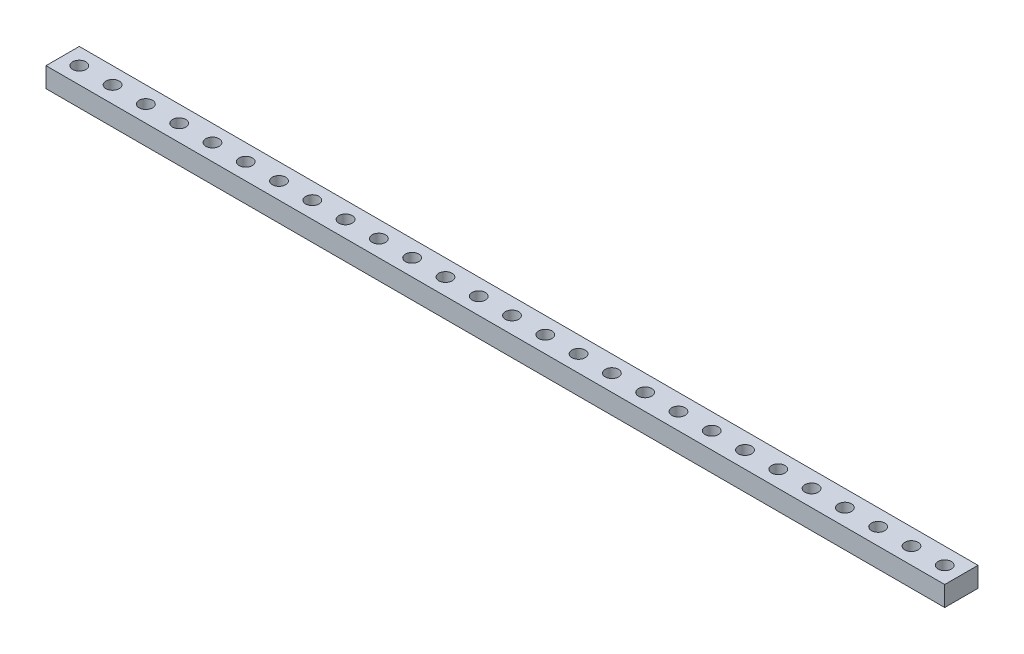
ISO-10303-21;
HEADER;
FILE_DESCRIPTION(('STEP AP214'),'2;1');
FILE_NAME('part.step','',(''),(''),'','','');
FILE_SCHEMA(('AUTOMOTIVE_DESIGN { 1 0 10303 214 1 1 1 1 }'));
ENDSEC;
DATA;
#1=APPLICATION_CONTEXT('core data for automotive mechanical design processes');
#2=APPLICATION_PROTOCOL_DEFINITION('international standard','automotive_design',2000,#1);
#3=PRODUCT_CONTEXT('',#1,'mechanical');
#4=PRODUCT('Part','Part','',(#3));
#5=PRODUCT_RELATED_PRODUCT_CATEGORY('part','',(#4));
#6=PRODUCT_DEFINITION_FORMATION('','',#4);
#7=PRODUCT_DEFINITION_CONTEXT('part definition',#1,'design');
#8=PRODUCT_DEFINITION('design','',#6,#7);
#9=PRODUCT_DEFINITION_SHAPE('','',#8);
#10=(LENGTH_UNIT() NAMED_UNIT(*) SI_UNIT(.MILLI.,.METRE.));
#11=(NAMED_UNIT(*) PLANE_ANGLE_UNIT() SI_UNIT($,.RADIAN.));
#12=(NAMED_UNIT(*) SI_UNIT($,.STERADIAN.) SOLID_ANGLE_UNIT());
#13=UNCERTAINTY_MEASURE_WITH_UNIT(LENGTH_MEASURE(1.E-05),#10,'distance_accuracy_value','');
#14=(GEOMETRIC_REPRESENTATION_CONTEXT(3) GLOBAL_UNCERTAINTY_ASSIGNED_CONTEXT((#13)) GLOBAL_UNIT_ASSIGNED_CONTEXT((#10,
#11,#12)) REPRESENTATION_CONTEXT('',''));
#15=CARTESIAN_POINT('',(0.,0.,0.));
#16=DIRECTION('',(0.,0.,1.));
#17=DIRECTION('',(1.,0.,0.));
#18=AXIS2_PLACEMENT_3D('',#15,#16,#17);
#19=CARTESIAN_POINT('',(0.,6.,0.));
#20=DIRECTION('',(0.,-1.,0.));
#21=DIRECTION('',(0.,0.,-1.));
#22=AXIS2_PLACEMENT_3D('',#19,#20,#21);
#23=PLANE('',#22);
#24=DIRECTION('',(1.,0.,0.));
#25=VECTOR('',#24,1.);
#26=CARTESIAN_POINT('',(0.,6.,0.));
#27=LINE('',#26,#25);
#28=CARTESIAN_POINT('',(-140.,6.,0.));
#29=VERTEX_POINT('',#28);
#30=CARTESIAN_POINT('',(130.,6.,0.));
#31=VERTEX_POINT('',#30);
#32=EDGE_CURVE('E90',#29,#31,#27,.T.);
#33=ORIENTED_EDGE('',*,*,#32,.T.);
#34=DIRECTION('',(0.,0.,1.));
#35=VECTOR('',#34,1.);
#36=CARTESIAN_POINT('',(130.,6.,-10.));
#37=LINE('',#36,#35);
#38=CARTESIAN_POINT('',(130.,6.,-10.));
#39=VERTEX_POINT('',#38);
#40=EDGE_CURVE('E263',#39,#31,#37,.T.);
#41=ORIENTED_EDGE('',*,*,#40,.F.);
#42=DIRECTION('',(-1.,0.,0.));
#43=VECTOR('',#42,1.);
#44=CARTESIAN_POINT('',(-140.,6.,-9.99999999999998));
#45=LINE('',#44,#43);
#46=CARTESIAN_POINT('',(-140.,6.,-9.99999999999998));
#47=VERTEX_POINT('',#46);
#48=EDGE_CURVE('E92',#39,#47,#45,.T.);
#49=ORIENTED_EDGE('',*,*,#48,.T.);
#50=DIRECTION('',(0.,0.,1.));
#51=VECTOR('',#50,1.);
#52=CARTESIAN_POINT('',(-140.,6.,0.));
#53=LINE('',#52,#51);
#54=EDGE_CURVE('E61',#47,#29,#53,.T.);
#55=ORIENTED_EDGE('',*,*,#54,.T.);
#56=EDGE_LOOP('',(#33,#41,#49,#55));
#57=FACE_BOUND('',#56,.T.);
#58=CARTESIAN_POINT('',(-135.,6.,-4.99999999999998));
#59=DIRECTION('',(0.,1.,0.));
#60=DIRECTION('',(0.,0.,1.));
#61=AXIS2_PLACEMENT_3D('',#58,#59,#60);
#62=CIRCLE('',#61,2.);
#63=CARTESIAN_POINT('',(-135.,6.,-2.99999999999999));
#64=VERTEX_POINT('',#63);
#65=EDGE_CURVE('E84',#64,#64,#62,.T.);
#66=ORIENTED_EDGE('',*,*,#65,.F.);
#67=EDGE_LOOP('',(#66));
#68=FACE_BOUND('',#67,.T.);
#69=CARTESIAN_POINT('',(-125.,6.,-4.99999999999998));
#70=DIRECTION('',(0.,1.,0.));
#71=DIRECTION('',(0.,0.,1.));
#72=AXIS2_PLACEMENT_3D('',#69,#70,#71);
#73=CIRCLE('',#72,1.99999999999998);
#74=CARTESIAN_POINT('',(-125.,6.,-3.));
#75=VERTEX_POINT('',#74);
#76=EDGE_CURVE('E101',#75,#75,#73,.T.);
#77=ORIENTED_EDGE('',*,*,#76,.F.);
#78=EDGE_LOOP('',(#77));
#79=FACE_BOUND('',#78,.T.);
#80=CARTESIAN_POINT('',(-115.,6.,-4.99999999999998));
#81=DIRECTION('',(0.,1.,0.));
#82=DIRECTION('',(0.,0.,1.));
#83=AXIS2_PLACEMENT_3D('',#80,#81,#82);
#84=CIRCLE('',#83,2.);
#85=CARTESIAN_POINT('',(-115.,6.,-2.99999999999999));
#86=VERTEX_POINT('',#85);
#87=EDGE_CURVE('E107',#86,#86,#84,.T.);
#88=ORIENTED_EDGE('',*,*,#87,.F.);
#89=EDGE_LOOP('',(#88));
#90=FACE_BOUND('',#89,.T.);
#91=CARTESIAN_POINT('',(-105.,6.,-4.99999999999998));
#92=DIRECTION('',(0.,1.,0.));
#93=DIRECTION('',(0.,0.,1.));
#94=AXIS2_PLACEMENT_3D('',#91,#92,#93);
#95=CIRCLE('',#94,2.);
#96=CARTESIAN_POINT('',(-105.,6.,-2.99999999999999));
#97=VERTEX_POINT('',#96);
#98=EDGE_CURVE('E113',#97,#97,#95,.T.);
#99=ORIENTED_EDGE('',*,*,#98,.F.);
#100=EDGE_LOOP('',(#99));
#101=FACE_BOUND('',#100,.T.);
#102=CARTESIAN_POINT('',(-95.,6.,-4.99999999999998));
#103=DIRECTION('',(0.,1.,0.));
#104=DIRECTION('',(0.,0.,1.));
#105=AXIS2_PLACEMENT_3D('',#102,#103,#104);
#106=CIRCLE('',#105,2.);
#107=CARTESIAN_POINT('',(-95.,6.,-2.99999999999999));
#108=VERTEX_POINT('',#107);
#109=EDGE_CURVE('E119',#108,#108,#106,.T.);
#110=ORIENTED_EDGE('',*,*,#109,.F.);
#111=EDGE_LOOP('',(#110));
#112=FACE_BOUND('',#111,.T.);
#113=CARTESIAN_POINT('',(-85.,6.,-4.99999999999998));
#114=DIRECTION('',(0.,1.,0.));
#115=DIRECTION('',(0.,0.,1.));
#116=AXIS2_PLACEMENT_3D('',#113,#114,#115);
#117=CIRCLE('',#116,2.);
#118=CARTESIAN_POINT('',(-85.,6.,-2.99999999999999));
#119=VERTEX_POINT('',#118);
#120=EDGE_CURVE('E125',#119,#119,#117,.T.);
#121=ORIENTED_EDGE('',*,*,#120,.F.);
#122=EDGE_LOOP('',(#121));
#123=FACE_BOUND('',#122,.T.);
#124=CARTESIAN_POINT('',(-75.,6.,-4.99999999999998));
#125=DIRECTION('',(0.,1.,0.));
#126=DIRECTION('',(0.,0.,1.));
#127=AXIS2_PLACEMENT_3D('',#124,#125,#126);
#128=CIRCLE('',#127,2.);
#129=CARTESIAN_POINT('',(-75.,6.,-2.99999999999999));
#130=VERTEX_POINT('',#129);
#131=EDGE_CURVE('E131',#130,#130,#128,.T.);
#132=ORIENTED_EDGE('',*,*,#131,.F.);
#133=EDGE_LOOP('',(#132));
#134=FACE_BOUND('',#133,.T.);
#135=CARTESIAN_POINT('',(-65.,6.,-4.99999999999998));
#136=DIRECTION('',(0.,1.,0.));
#137=DIRECTION('',(0.,0.,1.));
#138=AXIS2_PLACEMENT_3D('',#135,#136,#137);
#139=CIRCLE('',#138,2.);
#140=CARTESIAN_POINT('',(-65.,6.,-2.99999999999999));
#141=VERTEX_POINT('',#140);
#142=EDGE_CURVE('E137',#141,#141,#139,.T.);
#143=ORIENTED_EDGE('',*,*,#142,.F.);
#144=EDGE_LOOP('',(#143));
#145=FACE_BOUND('',#144,.T.);
#146=CARTESIAN_POINT('',(-55.,6.,-4.99999999999998));
#147=DIRECTION('',(0.,1.,0.));
#148=DIRECTION('',(0.,0.,1.));
#149=AXIS2_PLACEMENT_3D('',#146,#147,#148);
#150=CIRCLE('',#149,2.);
#151=CARTESIAN_POINT('',(-55.,6.,-2.99999999999999));
#152=VERTEX_POINT('',#151);
#153=EDGE_CURVE('E143',#152,#152,#150,.T.);
#154=ORIENTED_EDGE('',*,*,#153,.F.);
#155=EDGE_LOOP('',(#154));
#156=FACE_BOUND('',#155,.T.);
#157=CARTESIAN_POINT('',(-45.,6.,-4.99999999999998));
#158=DIRECTION('',(0.,1.,0.));
#159=DIRECTION('',(0.,0.,1.));
#160=AXIS2_PLACEMENT_3D('',#157,#158,#159);
#161=CIRCLE('',#160,2.);
#162=CARTESIAN_POINT('',(-45.,6.,-2.99999999999999));
#163=VERTEX_POINT('',#162);
#164=EDGE_CURVE('E149',#163,#163,#161,.T.);
#165=ORIENTED_EDGE('',*,*,#164,.F.);
#166=EDGE_LOOP('',(#165));
#167=FACE_BOUND('',#166,.T.);
#168=CARTESIAN_POINT('',(-35.,6.,-4.99999999999998));
#169=DIRECTION('',(0.,1.,0.));
#170=DIRECTION('',(0.,0.,1.));
#171=AXIS2_PLACEMENT_3D('',#168,#169,#170);
#172=CIRCLE('',#171,2.);
#173=CARTESIAN_POINT('',(-35.,6.,-2.99999999999999));
#174=VERTEX_POINT('',#173);
#175=EDGE_CURVE('E155',#174,#174,#172,.T.);
#176=ORIENTED_EDGE('',*,*,#175,.F.);
#177=EDGE_LOOP('',(#176));
#178=FACE_BOUND('',#177,.T.);
#179=CARTESIAN_POINT('',(-25.,6.,-4.99999999999998));
#180=DIRECTION('',(0.,1.,0.));
#181=DIRECTION('',(0.,0.,1.));
#182=AXIS2_PLACEMENT_3D('',#179,#180,#181);
#183=CIRCLE('',#182,2.);
#184=CARTESIAN_POINT('',(-25.,6.,-2.99999999999999));
#185=VERTEX_POINT('',#184);
#186=EDGE_CURVE('E161',#185,#185,#183,.T.);
#187=ORIENTED_EDGE('',*,*,#186,.F.);
#188=EDGE_LOOP('',(#187));
#189=FACE_BOUND('',#188,.T.);
#190=CARTESIAN_POINT('',(-15.,6.,-4.99999999999998));
#191=DIRECTION('',(0.,1.,0.));
#192=DIRECTION('',(0.,0.,1.));
#193=AXIS2_PLACEMENT_3D('',#190,#191,#192);
#194=CIRCLE('',#193,2.);
#195=CARTESIAN_POINT('',(-15.,6.,-2.99999999999999));
#196=VERTEX_POINT('',#195);
#197=EDGE_CURVE('E167',#196,#196,#194,.T.);
#198=ORIENTED_EDGE('',*,*,#197,.F.);
#199=EDGE_LOOP('',(#198));
#200=FACE_BOUND('',#199,.T.);
#201=CARTESIAN_POINT('',(-5.,6.,-4.99999999999998));
#202=DIRECTION('',(0.,1.,0.));
#203=DIRECTION('',(0.,0.,1.));
#204=AXIS2_PLACEMENT_3D('',#201,#202,#203);
#205=CIRCLE('',#204,2.);
#206=CARTESIAN_POINT('',(-5.,6.,-2.99999999999999));
#207=VERTEX_POINT('',#206);
#208=EDGE_CURVE('E173',#207,#207,#205,.T.);
#209=ORIENTED_EDGE('',*,*,#208,.F.);
#210=EDGE_LOOP('',(#209));
#211=FACE_BOUND('',#210,.T.);
#212=CARTESIAN_POINT('',(5.,6.,-4.99999999999998));
#213=DIRECTION('',(0.,1.,0.));
#214=DIRECTION('',(0.,0.,1.));
#215=AXIS2_PLACEMENT_3D('',#212,#213,#214);
#216=CIRCLE('',#215,2.);
#217=CARTESIAN_POINT('',(5.,6.,-2.99999999999999));
#218=VERTEX_POINT('',#217);
#219=EDGE_CURVE('E179',#218,#218,#216,.T.);
#220=ORIENTED_EDGE('',*,*,#219,.F.);
#221=EDGE_LOOP('',(#220));
#222=FACE_BOUND('',#221,.T.);
#223=CARTESIAN_POINT('',(15.,6.,-4.99999999999998));
#224=DIRECTION('',(0.,1.,0.));
#225=DIRECTION('',(0.,0.,1.));
#226=AXIS2_PLACEMENT_3D('',#223,#224,#225);
#227=CIRCLE('',#226,2.);
#228=CARTESIAN_POINT('',(15.,6.,-2.99999999999999));
#229=VERTEX_POINT('',#228);
#230=EDGE_CURVE('E185',#229,#229,#227,.T.);
#231=ORIENTED_EDGE('',*,*,#230,.F.);
#232=EDGE_LOOP('',(#231));
#233=FACE_BOUND('',#232,.T.);
#234=CARTESIAN_POINT('',(25.,6.,-4.99999999999998));
#235=DIRECTION('',(0.,1.,0.));
#236=DIRECTION('',(0.,0.,1.));
#237=AXIS2_PLACEMENT_3D('',#234,#235,#236);
#238=CIRCLE('',#237,2.);
#239=CARTESIAN_POINT('',(25.,6.,-2.99999999999999));
#240=VERTEX_POINT('',#239);
#241=EDGE_CURVE('E191',#240,#240,#238,.T.);
#242=ORIENTED_EDGE('',*,*,#241,.F.);
#243=EDGE_LOOP('',(#242));
#244=FACE_BOUND('',#243,.T.);
#245=CARTESIAN_POINT('',(35.,6.,-4.99999999999998));
#246=DIRECTION('',(0.,1.,0.));
#247=DIRECTION('',(0.,0.,1.));
#248=AXIS2_PLACEMENT_3D('',#245,#246,#247);
#249=CIRCLE('',#248,2.);
#250=CARTESIAN_POINT('',(35.,6.,-2.99999999999999));
#251=VERTEX_POINT('',#250);
#252=EDGE_CURVE('E197',#251,#251,#249,.T.);
#253=ORIENTED_EDGE('',*,*,#252,.F.);
#254=EDGE_LOOP('',(#253));
#255=FACE_BOUND('',#254,.T.);
#256=CARTESIAN_POINT('',(45.,6.,-4.99999999999998));
#257=DIRECTION('',(0.,1.,0.));
#258=DIRECTION('',(0.,0.,1.));
#259=AXIS2_PLACEMENT_3D('',#256,#257,#258);
#260=CIRCLE('',#259,2.);
#261=CARTESIAN_POINT('',(45.,6.,-2.99999999999999));
#262=VERTEX_POINT('',#261);
#263=EDGE_CURVE('E203',#262,#262,#260,.T.);
#264=ORIENTED_EDGE('',*,*,#263,.F.);
#265=EDGE_LOOP('',(#264));
#266=FACE_BOUND('',#265,.T.);
#267=CARTESIAN_POINT('',(55.,6.,-4.99999999999998));
#268=DIRECTION('',(0.,1.,0.));
#269=DIRECTION('',(0.,0.,1.));
#270=AXIS2_PLACEMENT_3D('',#267,#268,#269);
#271=CIRCLE('',#270,2.);
#272=CARTESIAN_POINT('',(55.,6.,-2.99999999999999));
#273=VERTEX_POINT('',#272);
#274=EDGE_CURVE('E209',#273,#273,#271,.T.);
#275=ORIENTED_EDGE('',*,*,#274,.F.);
#276=EDGE_LOOP('',(#275));
#277=FACE_BOUND('',#276,.T.);
#278=CARTESIAN_POINT('',(65.,6.,-4.99999999999998));
#279=DIRECTION('',(0.,1.,0.));
#280=DIRECTION('',(0.,0.,1.));
#281=AXIS2_PLACEMENT_3D('',#278,#279,#280);
#282=CIRCLE('',#281,2.);
#283=CARTESIAN_POINT('',(65.,6.,-2.99999999999999));
#284=VERTEX_POINT('',#283);
#285=EDGE_CURVE('E215',#284,#284,#282,.T.);
#286=ORIENTED_EDGE('',*,*,#285,.F.);
#287=EDGE_LOOP('',(#286));
#288=FACE_BOUND('',#287,.T.);
#289=CARTESIAN_POINT('',(75.,6.,-4.99999999999998));
#290=DIRECTION('',(0.,1.,0.));
#291=DIRECTION('',(0.,0.,1.));
#292=AXIS2_PLACEMENT_3D('',#289,#290,#291);
#293=CIRCLE('',#292,2.);
#294=CARTESIAN_POINT('',(75.,6.,-2.99999999999999));
#295=VERTEX_POINT('',#294);
#296=EDGE_CURVE('E221',#295,#295,#293,.T.);
#297=ORIENTED_EDGE('',*,*,#296,.F.);
#298=EDGE_LOOP('',(#297));
#299=FACE_BOUND('',#298,.T.);
#300=CARTESIAN_POINT('',(85.,6.,-4.99999999999998));
#301=DIRECTION('',(0.,1.,0.));
#302=DIRECTION('',(0.,0.,1.));
#303=AXIS2_PLACEMENT_3D('',#300,#301,#302);
#304=CIRCLE('',#303,2.);
#305=CARTESIAN_POINT('',(85.,6.,-2.99999999999999));
#306=VERTEX_POINT('',#305);
#307=EDGE_CURVE('E227',#306,#306,#304,.T.);
#308=ORIENTED_EDGE('',*,*,#307,.F.);
#309=EDGE_LOOP('',(#308));
#310=FACE_BOUND('',#309,.T.);
#311=CARTESIAN_POINT('',(95.,6.,-4.99999999999998));
#312=DIRECTION('',(0.,1.,0.));
#313=DIRECTION('',(0.,0.,1.));
#314=AXIS2_PLACEMENT_3D('',#311,#312,#313);
#315=CIRCLE('',#314,2.);
#316=CARTESIAN_POINT('',(95.,6.,-2.99999999999999));
#317=VERTEX_POINT('',#316);
#318=EDGE_CURVE('E233',#317,#317,#315,.T.);
#319=ORIENTED_EDGE('',*,*,#318,.F.);
#320=EDGE_LOOP('',(#319));
#321=FACE_BOUND('',#320,.T.);
#322=CARTESIAN_POINT('',(105.,6.,-4.99999999999998));
#323=DIRECTION('',(0.,1.,0.));
#324=DIRECTION('',(0.,0.,1.));
#325=AXIS2_PLACEMENT_3D('',#322,#323,#324);
#326=CIRCLE('',#325,2.);
#327=CARTESIAN_POINT('',(105.,6.,-2.99999999999999));
#328=VERTEX_POINT('',#327);
#329=EDGE_CURVE('E239',#328,#328,#326,.T.);
#330=ORIENTED_EDGE('',*,*,#329,.F.);
#331=EDGE_LOOP('',(#330));
#332=FACE_BOUND('',#331,.T.);
#333=CARTESIAN_POINT('',(115.,6.,-4.99999999999998));
#334=DIRECTION('',(0.,1.,0.));
#335=DIRECTION('',(0.,0.,1.));
#336=AXIS2_PLACEMENT_3D('',#333,#334,#335);
#337=CIRCLE('',#336,2.);
#338=CARTESIAN_POINT('',(115.,6.,-2.99999999999999));
#339=VERTEX_POINT('',#338);
#340=EDGE_CURVE('E245',#339,#339,#337,.T.);
#341=ORIENTED_EDGE('',*,*,#340,.F.);
#342=EDGE_LOOP('',(#341));
#343=FACE_BOUND('',#342,.T.);
#344=CARTESIAN_POINT('',(125.,6.,-4.99999999999998));
#345=DIRECTION('',(0.,1.,0.));
#346=DIRECTION('',(0.,0.,1.));
#347=AXIS2_PLACEMENT_3D('',#344,#345,#346);
#348=CIRCLE('',#347,2.);
#349=CARTESIAN_POINT('',(125.,6.,-2.99999999999999));
#350=VERTEX_POINT('',#349);
#351=EDGE_CURVE('E251',#350,#350,#348,.T.);
#352=ORIENTED_EDGE('',*,*,#351,.F.);
#353=EDGE_LOOP('',(#352));
#354=FACE_BOUND('',#353,.T.);
#355=ADVANCED_FACE('F37',(#57,#68,#79,#90,#101,#112,#123,#134,#145,#156,#167,#178,#189,#200,
#211,#222,#233,#244,#255,#266,#277,#288,#299,#310,#321,#332,#343,#354),#23,.F.);
#356=CARTESIAN_POINT('',(0.,0.,0.));
#357=DIRECTION('',(0.,-1.,0.));
#358=DIRECTION('',(0.,0.,-1.));
#359=AXIS2_PLACEMENT_3D('',#356,#357,#358);
#360=PLANE('',#359);
#361=DIRECTION('',(0.,0.,1.));
#362=VECTOR('',#361,1.);
#363=CARTESIAN_POINT('',(130.,0.,-10.));
#364=LINE('',#363,#362);
#365=CARTESIAN_POINT('',(130.,0.,-9.99999999999998));
#366=VERTEX_POINT('',#365);
#367=CARTESIAN_POINT('',(130.,0.,0.));
#368=VERTEX_POINT('',#367);
#369=EDGE_CURVE('E52',#366,#368,#364,.T.);
#370=ORIENTED_EDGE('',*,*,#369,.T.);
#371=DIRECTION('',(1.,0.,0.));
#372=VECTOR('',#371,1.);
#373=CARTESIAN_POINT('',(0.,0.,0.));
#374=LINE('',#373,#372);
#375=CARTESIAN_POINT('',(-140.,0.,0.));
#376=VERTEX_POINT('',#375);
#377=EDGE_CURVE('E74',#376,#368,#374,.T.);
#378=ORIENTED_EDGE('',*,*,#377,.F.);
#379=DIRECTION('',(0.,0.,1.));
#380=VECTOR('',#379,1.);
#381=CARTESIAN_POINT('',(-140.,0.,0.));
#382=LINE('',#381,#380);
#383=CARTESIAN_POINT('',(-140.,0.,-9.99999999999998));
#384=VERTEX_POINT('',#383);
#385=EDGE_CURVE('E79',#384,#376,#382,.T.);
#386=ORIENTED_EDGE('',*,*,#385,.F.);
#387=DIRECTION('',(-1.,0.,0.));
#388=VECTOR('',#387,1.);
#389=CARTESIAN_POINT('',(-140.,0.,-9.99999999999998));
#390=LINE('',#389,#388);
#391=EDGE_CURVE('E83',#366,#384,#390,.T.);
#392=ORIENTED_EDGE('',*,*,#391,.F.);
#393=EDGE_LOOP('',(#370,#378,#386,#392));
#394=FACE_BOUND('',#393,.T.);
#395=CARTESIAN_POINT('',(125.,0.,-4.99999999999998));
#396=DIRECTION('',(0.,1.,0.));
#397=DIRECTION('',(0.,0.,1.));
#398=AXIS2_PLACEMENT_3D('',#395,#396,#397);
#399=CIRCLE('',#398,2.);
#400=CARTESIAN_POINT('',(125.,0.,-2.99999999999999));
#401=VERTEX_POINT('',#400);
#402=EDGE_CURVE('E254',#401,#401,#399,.T.);
#403=ORIENTED_EDGE('',*,*,#402,.T.);
#404=EDGE_LOOP('',(#403));
#405=FACE_BOUND('',#404,.T.);
#406=CARTESIAN_POINT('',(105.,0.,-4.99999999999998));
#407=DIRECTION('',(0.,1.,0.));
#408=DIRECTION('',(0.,0.,1.));
#409=AXIS2_PLACEMENT_3D('',#406,#407,#408);
#410=CIRCLE('',#409,2.);
#411=CARTESIAN_POINT('',(105.,0.,-2.99999999999999));
#412=VERTEX_POINT('',#411);
#413=EDGE_CURVE('E242',#412,#412,#410,.T.);
#414=ORIENTED_EDGE('',*,*,#413,.T.);
#415=EDGE_LOOP('',(#414));
#416=FACE_BOUND('',#415,.T.);
#417=CARTESIAN_POINT('',(85.,0.,-4.99999999999998));
#418=DIRECTION('',(0.,1.,0.));
#419=DIRECTION('',(0.,0.,1.));
#420=AXIS2_PLACEMENT_3D('',#417,#418,#419);
#421=CIRCLE('',#420,2.);
#422=CARTESIAN_POINT('',(85.,0.,-2.99999999999999));
#423=VERTEX_POINT('',#422);
#424=EDGE_CURVE('E230',#423,#423,#421,.T.);
#425=ORIENTED_EDGE('',*,*,#424,.T.);
#426=EDGE_LOOP('',(#425));
#427=FACE_BOUND('',#426,.T.);
#428=CARTESIAN_POINT('',(65.,0.,-4.99999999999998));
#429=DIRECTION('',(0.,1.,0.));
#430=DIRECTION('',(0.,0.,1.));
#431=AXIS2_PLACEMENT_3D('',#428,#429,#430);
#432=CIRCLE('',#431,2.);
#433=CARTESIAN_POINT('',(65.,0.,-2.99999999999999));
#434=VERTEX_POINT('',#433);
#435=EDGE_CURVE('E218',#434,#434,#432,.T.);
#436=ORIENTED_EDGE('',*,*,#435,.T.);
#437=EDGE_LOOP('',(#436));
#438=FACE_BOUND('',#437,.T.);
#439=CARTESIAN_POINT('',(45.,0.,-4.99999999999998));
#440=DIRECTION('',(0.,1.,0.));
#441=DIRECTION('',(0.,0.,1.));
#442=AXIS2_PLACEMENT_3D('',#439,#440,#441);
#443=CIRCLE('',#442,2.);
#444=CARTESIAN_POINT('',(45.,0.,-2.99999999999999));
#445=VERTEX_POINT('',#444);
#446=EDGE_CURVE('E206',#445,#445,#443,.T.);
#447=ORIENTED_EDGE('',*,*,#446,.T.);
#448=EDGE_LOOP('',(#447));
#449=FACE_BOUND('',#448,.T.);
#450=CARTESIAN_POINT('',(25.,0.,-4.99999999999998));
#451=DIRECTION('',(0.,1.,0.));
#452=DIRECTION('',(0.,0.,1.));
#453=AXIS2_PLACEMENT_3D('',#450,#451,#452);
#454=CIRCLE('',#453,2.);
#455=CARTESIAN_POINT('',(25.,0.,-2.99999999999999));
#456=VERTEX_POINT('',#455);
#457=EDGE_CURVE('E194',#456,#456,#454,.T.);
#458=ORIENTED_EDGE('',*,*,#457,.T.);
#459=EDGE_LOOP('',(#458));
#460=FACE_BOUND('',#459,.T.);
#461=CARTESIAN_POINT('',(5.,0.,-4.99999999999998));
#462=DIRECTION('',(0.,1.,0.));
#463=DIRECTION('',(0.,0.,1.));
#464=AXIS2_PLACEMENT_3D('',#461,#462,#463);
#465=CIRCLE('',#464,2.);
#466=CARTESIAN_POINT('',(5.,0.,-2.99999999999999));
#467=VERTEX_POINT('',#466);
#468=EDGE_CURVE('E182',#467,#467,#465,.T.);
#469=ORIENTED_EDGE('',*,*,#468,.T.);
#470=EDGE_LOOP('',(#469));
#471=FACE_BOUND('',#470,.T.);
#472=CARTESIAN_POINT('',(-15.,0.,-4.99999999999998));
#473=DIRECTION('',(0.,1.,0.));
#474=DIRECTION('',(0.,0.,1.));
#475=AXIS2_PLACEMENT_3D('',#472,#473,#474);
#476=CIRCLE('',#475,2.);
#477=CARTESIAN_POINT('',(-15.,0.,-2.99999999999999));
#478=VERTEX_POINT('',#477);
#479=EDGE_CURVE('E170',#478,#478,#476,.T.);
#480=ORIENTED_EDGE('',*,*,#479,.T.);
#481=EDGE_LOOP('',(#480));
#482=FACE_BOUND('',#481,.T.);
#483=CARTESIAN_POINT('',(-35.,0.,-4.99999999999998));
#484=DIRECTION('',(0.,1.,0.));
#485=DIRECTION('',(0.,0.,1.));
#486=AXIS2_PLACEMENT_3D('',#483,#484,#485);
#487=CIRCLE('',#486,2.);
#488=CARTESIAN_POINT('',(-35.,0.,-2.99999999999999));
#489=VERTEX_POINT('',#488);
#490=EDGE_CURVE('E158',#489,#489,#487,.T.);
#491=ORIENTED_EDGE('',*,*,#490,.T.);
#492=EDGE_LOOP('',(#491));
#493=FACE_BOUND('',#492,.T.);
#494=CARTESIAN_POINT('',(-55.,0.,-4.99999999999998));
#495=DIRECTION('',(0.,1.,0.));
#496=DIRECTION('',(0.,0.,1.));
#497=AXIS2_PLACEMENT_3D('',#494,#495,#496);
#498=CIRCLE('',#497,2.);
#499=CARTESIAN_POINT('',(-55.,0.,-2.99999999999999));
#500=VERTEX_POINT('',#499);
#501=EDGE_CURVE('E146',#500,#500,#498,.T.);
#502=ORIENTED_EDGE('',*,*,#501,.T.);
#503=EDGE_LOOP('',(#502));
#504=FACE_BOUND('',#503,.T.);
#505=CARTESIAN_POINT('',(-75.,0.,-4.99999999999998));
#506=DIRECTION('',(0.,1.,0.));
#507=DIRECTION('',(0.,0.,1.));
#508=AXIS2_PLACEMENT_3D('',#505,#506,#507);
#509=CIRCLE('',#508,2.);
#510=CARTESIAN_POINT('',(-75.,0.,-2.99999999999999));
#511=VERTEX_POINT('',#510);
#512=EDGE_CURVE('E134',#511,#511,#509,.T.);
#513=ORIENTED_EDGE('',*,*,#512,.T.);
#514=EDGE_LOOP('',(#513));
#515=FACE_BOUND('',#514,.T.);
#516=CARTESIAN_POINT('',(-95.,0.,-4.99999999999998));
#517=DIRECTION('',(0.,1.,0.));
#518=DIRECTION('',(0.,0.,1.));
#519=AXIS2_PLACEMENT_3D('',#516,#517,#518);
#520=CIRCLE('',#519,2.);
#521=CARTESIAN_POINT('',(-95.,0.,-2.99999999999999));
#522=VERTEX_POINT('',#521);
#523=EDGE_CURVE('E122',#522,#522,#520,.T.);
#524=ORIENTED_EDGE('',*,*,#523,.T.);
#525=EDGE_LOOP('',(#524));
#526=FACE_BOUND('',#525,.T.);
#527=CARTESIAN_POINT('',(-115.,0.,-4.99999999999998));
#528=DIRECTION('',(0.,1.,0.));
#529=DIRECTION('',(0.,0.,1.));
#530=AXIS2_PLACEMENT_3D('',#527,#528,#529);
#531=CIRCLE('',#530,2.);
#532=CARTESIAN_POINT('',(-115.,0.,-2.99999999999999));
#533=VERTEX_POINT('',#532);
#534=EDGE_CURVE('E110',#533,#533,#531,.T.);
#535=ORIENTED_EDGE('',*,*,#534,.T.);
#536=EDGE_LOOP('',(#535));
#537=FACE_BOUND('',#536,.T.);
#538=CARTESIAN_POINT('',(-135.,0.,-4.99999999999998));
#539=DIRECTION('',(0.,1.,0.));
#540=DIRECTION('',(0.,0.,1.));
#541=AXIS2_PLACEMENT_3D('',#538,#539,#540);
#542=CIRCLE('',#541,2.);
#543=CARTESIAN_POINT('',(-135.,0.,-2.99999999999999));
#544=VERTEX_POINT('',#543);
#545=EDGE_CURVE('E98',#544,#544,#542,.T.);
#546=ORIENTED_EDGE('',*,*,#545,.T.);
#547=EDGE_LOOP('',(#546));
#548=FACE_BOUND('',#547,.T.);
#549=CARTESIAN_POINT('',(-125.,0.,-4.99999999999998));
#550=DIRECTION('',(0.,1.,0.));
#551=DIRECTION('',(0.,0.,1.));
#552=AXIS2_PLACEMENT_3D('',#549,#550,#551);
#553=CIRCLE('',#552,1.99999999999998);
#554=CARTESIAN_POINT('',(-125.,0.,-3.));
#555=VERTEX_POINT('',#554);
#556=EDGE_CURVE('E104',#555,#555,#553,.T.);
#557=ORIENTED_EDGE('',*,*,#556,.T.);
#558=EDGE_LOOP('',(#557));
#559=FACE_BOUND('',#558,.T.);
#560=CARTESIAN_POINT('',(-105.,0.,-4.99999999999998));
#561=DIRECTION('',(0.,1.,0.));
#562=DIRECTION('',(0.,0.,1.));
#563=AXIS2_PLACEMENT_3D('',#560,#561,#562);
#564=CIRCLE('',#563,2.);
#565=CARTESIAN_POINT('',(-105.,0.,-2.99999999999999));
#566=VERTEX_POINT('',#565);
#567=EDGE_CURVE('E116',#566,#566,#564,.T.);
#568=ORIENTED_EDGE('',*,*,#567,.T.);
#569=EDGE_LOOP('',(#568));
#570=FACE_BOUND('',#569,.T.);
#571=CARTESIAN_POINT('',(-85.,0.,-4.99999999999998));
#572=DIRECTION('',(0.,1.,0.));
#573=DIRECTION('',(0.,0.,1.));
#574=AXIS2_PLACEMENT_3D('',#571,#572,#573);
#575=CIRCLE('',#574,2.);
#576=CARTESIAN_POINT('',(-85.,0.,-2.99999999999999));
#577=VERTEX_POINT('',#576);
#578=EDGE_CURVE('E128',#577,#577,#575,.T.);
#579=ORIENTED_EDGE('',*,*,#578,.T.);
#580=EDGE_LOOP('',(#579));
#581=FACE_BOUND('',#580,.T.);
#582=CARTESIAN_POINT('',(-65.,0.,-4.99999999999998));
#583=DIRECTION('',(0.,1.,0.));
#584=DIRECTION('',(0.,0.,1.));
#585=AXIS2_PLACEMENT_3D('',#582,#583,#584);
#586=CIRCLE('',#585,2.);
#587=CARTESIAN_POINT('',(-65.,0.,-2.99999999999999));
#588=VERTEX_POINT('',#587);
#589=EDGE_CURVE('E140',#588,#588,#586,.T.);
#590=ORIENTED_EDGE('',*,*,#589,.T.);
#591=EDGE_LOOP('',(#590));
#592=FACE_BOUND('',#591,.T.);
#593=CARTESIAN_POINT('',(-45.,0.,-4.99999999999998));
#594=DIRECTION('',(0.,1.,0.));
#595=DIRECTION('',(0.,0.,1.));
#596=AXIS2_PLACEMENT_3D('',#593,#594,#595);
#597=CIRCLE('',#596,2.);
#598=CARTESIAN_POINT('',(-45.,0.,-2.99999999999999));
#599=VERTEX_POINT('',#598);
#600=EDGE_CURVE('E152',#599,#599,#597,.T.);
#601=ORIENTED_EDGE('',*,*,#600,.T.);
#602=EDGE_LOOP('',(#601));
#603=FACE_BOUND('',#602,.T.);
#604=CARTESIAN_POINT('',(-25.,0.,-4.99999999999998));
#605=DIRECTION('',(0.,1.,0.));
#606=DIRECTION('',(0.,0.,1.));
#607=AXIS2_PLACEMENT_3D('',#604,#605,#606);
#608=CIRCLE('',#607,2.);
#609=CARTESIAN_POINT('',(-25.,0.,-2.99999999999999));
#610=VERTEX_POINT('',#609);
#611=EDGE_CURVE('E164',#610,#610,#608,.T.);
#612=ORIENTED_EDGE('',*,*,#611,.T.);
#613=EDGE_LOOP('',(#612));
#614=FACE_BOUND('',#613,.T.);
#615=CARTESIAN_POINT('',(-5.,0.,-4.99999999999998));
#616=DIRECTION('',(0.,1.,0.));
#617=DIRECTION('',(0.,0.,1.));
#618=AXIS2_PLACEMENT_3D('',#615,#616,#617);
#619=CIRCLE('',#618,2.);
#620=CARTESIAN_POINT('',(-5.,0.,-2.99999999999999));
#621=VERTEX_POINT('',#620);
#622=EDGE_CURVE('E176',#621,#621,#619,.T.);
#623=ORIENTED_EDGE('',*,*,#622,.T.);
#624=EDGE_LOOP('',(#623));
#625=FACE_BOUND('',#624,.T.);
#626=CARTESIAN_POINT('',(15.,0.,-4.99999999999998));
#627=DIRECTION('',(0.,1.,0.));
#628=DIRECTION('',(0.,0.,1.));
#629=AXIS2_PLACEMENT_3D('',#626,#627,#628);
#630=CIRCLE('',#629,2.);
#631=CARTESIAN_POINT('',(15.,0.,-2.99999999999999));
#632=VERTEX_POINT('',#631);
#633=EDGE_CURVE('E188',#632,#632,#630,.T.);
#634=ORIENTED_EDGE('',*,*,#633,.T.);
#635=EDGE_LOOP('',(#634));
#636=FACE_BOUND('',#635,.T.);
#637=CARTESIAN_POINT('',(35.,0.,-4.99999999999998));
#638=DIRECTION('',(0.,1.,0.));
#639=DIRECTION('',(0.,0.,1.));
#640=AXIS2_PLACEMENT_3D('',#637,#638,#639);
#641=CIRCLE('',#640,2.);
#642=CARTESIAN_POINT('',(35.,0.,-2.99999999999999));
#643=VERTEX_POINT('',#642);
#644=EDGE_CURVE('E200',#643,#643,#641,.T.);
#645=ORIENTED_EDGE('',*,*,#644,.T.);
#646=EDGE_LOOP('',(#645));
#647=FACE_BOUND('',#646,.T.);
#648=CARTESIAN_POINT('',(55.,0.,-4.99999999999998));
#649=DIRECTION('',(0.,1.,0.));
#650=DIRECTION('',(0.,0.,1.));
#651=AXIS2_PLACEMENT_3D('',#648,#649,#650);
#652=CIRCLE('',#651,2.);
#653=CARTESIAN_POINT('',(55.,0.,-2.99999999999999));
#654=VERTEX_POINT('',#653);
#655=EDGE_CURVE('E212',#654,#654,#652,.T.);
#656=ORIENTED_EDGE('',*,*,#655,.T.);
#657=EDGE_LOOP('',(#656));
#658=FACE_BOUND('',#657,.T.);
#659=CARTESIAN_POINT('',(75.,0.,-4.99999999999998));
#660=DIRECTION('',(0.,1.,0.));
#661=DIRECTION('',(0.,0.,1.));
#662=AXIS2_PLACEMENT_3D('',#659,#660,#661);
#663=CIRCLE('',#662,2.);
#664=CARTESIAN_POINT('',(75.,0.,-2.99999999999999));
#665=VERTEX_POINT('',#664);
#666=EDGE_CURVE('E224',#665,#665,#663,.T.);
#667=ORIENTED_EDGE('',*,*,#666,.T.);
#668=EDGE_LOOP('',(#667));
#669=FACE_BOUND('',#668,.T.);
#670=CARTESIAN_POINT('',(95.,0.,-4.99999999999998));
#671=DIRECTION('',(0.,1.,0.));
#672=DIRECTION('',(0.,0.,1.));
#673=AXIS2_PLACEMENT_3D('',#670,#671,#672);
#674=CIRCLE('',#673,2.);
#675=CARTESIAN_POINT('',(95.,0.,-2.99999999999999));
#676=VERTEX_POINT('',#675);
#677=EDGE_CURVE('E236',#676,#676,#674,.T.);
#678=ORIENTED_EDGE('',*,*,#677,.T.);
#679=EDGE_LOOP('',(#678));
#680=FACE_BOUND('',#679,.T.);
#681=CARTESIAN_POINT('',(115.,0.,-4.99999999999998));
#682=DIRECTION('',(0.,1.,0.));
#683=DIRECTION('',(0.,0.,1.));
#684=AXIS2_PLACEMENT_3D('',#681,#682,#683);
#685=CIRCLE('',#684,2.);
#686=CARTESIAN_POINT('',(115.,0.,-2.99999999999999));
#687=VERTEX_POINT('',#686);
#688=EDGE_CURVE('E248',#687,#687,#685,.T.);
#689=ORIENTED_EDGE('',*,*,#688,.T.);
#690=EDGE_LOOP('',(#689));
#691=FACE_BOUND('',#690,.T.);
#692=ADVANCED_FACE('F76',(#394,#405,#416,#427,#438,#449,#460,#471,#482,#493,#504,#515,#526,#537,
#548,#559,#570,#581,#592,#603,#614,#625,#636,#647,#658,#669,#680,#691),#360,.T.);
#693=CARTESIAN_POINT('',(0.,6.,0.));
#694=DIRECTION('',(0.,0.,-1.));
#695=DIRECTION('',(-1.,0.,0.));
#696=AXIS2_PLACEMENT_3D('',#693,#694,#695);
#697=PLANE('',#696);
#698=ORIENTED_EDGE('',*,*,#377,.T.);
#699=DIRECTION('',(0.,1.,0.));
#700=VECTOR('',#699,1.);
#701=CARTESIAN_POINT('',(130.,-0.00100000000000013,0.));
#702=LINE('',#701,#700);
#703=EDGE_CURVE('E260',#368,#31,#702,.T.);
#704=ORIENTED_EDGE('',*,*,#703,.T.);
#705=ORIENTED_EDGE('',*,*,#32,.F.);
#706=DIRECTION('',(0.,-1.,0.));
#707=VECTOR('',#706,1.);
#708=CARTESIAN_POINT('',(-140.,6.,0.));
#709=LINE('',#708,#707);
#710=EDGE_CURVE('E45',#29,#376,#709,.T.);
#711=ORIENTED_EDGE('',*,*,#710,.T.);
#712=EDGE_LOOP('',(#698,#704,#705,#711));
#713=FACE_BOUND('',#712,.T.);
#714=ADVANCED_FACE('F39',(#713),#697,.F.);
#715=CARTESIAN_POINT('',(-140.,6.,-9.99999999999998));
#716=DIRECTION('',(0.,0.,1.));
#717=DIRECTION('',(1.,0.,0.));
#718=AXIS2_PLACEMENT_3D('',#715,#716,#717);
#719=PLANE('',#718);
#720=ORIENTED_EDGE('',*,*,#48,.F.);
#721=DIRECTION('',(0.,1.,0.));
#722=VECTOR('',#721,1.);
#723=CARTESIAN_POINT('',(130.,-0.00100000000000013,-10.));
#724=LINE('',#723,#722);
#725=EDGE_CURVE('E261',#366,#39,#724,.T.);
#726=ORIENTED_EDGE('',*,*,#725,.F.);
#727=ORIENTED_EDGE('',*,*,#391,.T.);
#728=DIRECTION('',(0.,-1.,0.));
#729=VECTOR('',#728,1.);
#730=CARTESIAN_POINT('',(-140.,6.,-9.99999999999998));
#731=LINE('',#730,#729);
#732=EDGE_CURVE('E11',#47,#384,#731,.T.);
#733=ORIENTED_EDGE('',*,*,#732,.F.);
#734=EDGE_LOOP('',(#720,#726,#727,#733));
#735=FACE_BOUND('',#734,.T.);
#736=ADVANCED_FACE('F498',(#735),#719,.F.);
#737=CARTESIAN_POINT('',(-140.,6.,0.));
#738=DIRECTION('',(1.,0.,0.));
#739=DIRECTION('',(0.,0.,-1.));
#740=AXIS2_PLACEMENT_3D('',#737,#738,#739);
#741=PLANE('',#740);
#742=ORIENTED_EDGE('',*,*,#385,.T.);
#743=ORIENTED_EDGE('',*,*,#710,.F.);
#744=ORIENTED_EDGE('',*,*,#54,.F.);
#745=ORIENTED_EDGE('',*,*,#732,.T.);
#746=EDGE_LOOP('',(#742,#743,#744,#745));
#747=FACE_BOUND('',#746,.T.);
#748=ADVANCED_FACE('F87',(#747),#741,.F.);
#749=CARTESIAN_POINT('',(-135.,6.,-4.99999999999998));
#750=DIRECTION('',(0.,-1.,0.));
#751=DIRECTION('',(0.,0.,-1.));
#752=AXIS2_PLACEMENT_3D('',#749,#750,#751);
#753=CYLINDRICAL_SURFACE('',#752,2.);
#754=ORIENTED_EDGE('',*,*,#65,.T.);
#755=EDGE_LOOP('',(#754));
#756=FACE_BOUND('',#755,.T.);
#757=ORIENTED_EDGE('',*,*,#545,.F.);
#758=EDGE_LOOP('',(#757));
#759=FACE_BOUND('',#758,.T.);
#760=ADVANCED_FACE('F492',(#756,#759),#753,.F.);
#761=CARTESIAN_POINT('',(-125.,6.,-4.99999999999998));
#762=DIRECTION('',(0.,-1.,0.));
#763=DIRECTION('',(0.,0.,-1.));
#764=AXIS2_PLACEMENT_3D('',#761,#762,#763);
#765=CYLINDRICAL_SURFACE('',#764,1.99999999999998);
#766=ORIENTED_EDGE('',*,*,#76,.T.);
#767=EDGE_LOOP('',(#766));
#768=FACE_BOUND('',#767,.T.);
#769=ORIENTED_EDGE('',*,*,#556,.F.);
#770=EDGE_LOOP('',(#769));
#771=FACE_BOUND('',#770,.T.);
#772=ADVANCED_FACE('F488',(#768,#771),#765,.F.);
#773=CARTESIAN_POINT('',(-115.,6.,-4.99999999999998));
#774=DIRECTION('',(0.,-1.,0.));
#775=DIRECTION('',(0.,0.,-1.));
#776=AXIS2_PLACEMENT_3D('',#773,#774,#775);
#777=CYLINDRICAL_SURFACE('',#776,2.);
#778=ORIENTED_EDGE('',*,*,#87,.T.);
#779=EDGE_LOOP('',(#778));
#780=FACE_BOUND('',#779,.T.);
#781=ORIENTED_EDGE('',*,*,#534,.F.);
#782=EDGE_LOOP('',(#781));
#783=FACE_BOUND('',#782,.T.);
#784=ADVANCED_FACE('F484',(#780,#783),#777,.F.);
#785=CARTESIAN_POINT('',(-105.,6.,-4.99999999999998));
#786=DIRECTION('',(0.,-1.,0.));
#787=DIRECTION('',(0.,0.,-1.));
#788=AXIS2_PLACEMENT_3D('',#785,#786,#787);
#789=CYLINDRICAL_SURFACE('',#788,2.);
#790=ORIENTED_EDGE('',*,*,#98,.T.);
#791=EDGE_LOOP('',(#790));
#792=FACE_BOUND('',#791,.T.);
#793=ORIENTED_EDGE('',*,*,#567,.F.);
#794=EDGE_LOOP('',(#793));
#795=FACE_BOUND('',#794,.T.);
#796=ADVANCED_FACE('F480',(#792,#795),#789,.F.);
#797=CARTESIAN_POINT('',(-95.,6.,-4.99999999999998));
#798=DIRECTION('',(0.,-1.,0.));
#799=DIRECTION('',(0.,0.,-1.));
#800=AXIS2_PLACEMENT_3D('',#797,#798,#799);
#801=CYLINDRICAL_SURFACE('',#800,2.);
#802=ORIENTED_EDGE('',*,*,#109,.T.);
#803=EDGE_LOOP('',(#802));
#804=FACE_BOUND('',#803,.T.);
#805=ORIENTED_EDGE('',*,*,#523,.F.);
#806=EDGE_LOOP('',(#805));
#807=FACE_BOUND('',#806,.T.);
#808=ADVANCED_FACE('F476',(#804,#807),#801,.F.);
#809=CARTESIAN_POINT('',(-85.,6.,-4.99999999999998));
#810=DIRECTION('',(0.,-1.,0.));
#811=DIRECTION('',(0.,0.,-1.));
#812=AXIS2_PLACEMENT_3D('',#809,#810,#811);
#813=CYLINDRICAL_SURFACE('',#812,2.);
#814=ORIENTED_EDGE('',*,*,#120,.T.);
#815=EDGE_LOOP('',(#814));
#816=FACE_BOUND('',#815,.T.);
#817=ORIENTED_EDGE('',*,*,#578,.F.);
#818=EDGE_LOOP('',(#817));
#819=FACE_BOUND('',#818,.T.);
#820=ADVANCED_FACE('F472',(#816,#819),#813,.F.);
#821=CARTESIAN_POINT('',(-75.,6.,-4.99999999999998));
#822=DIRECTION('',(0.,-1.,0.));
#823=DIRECTION('',(0.,0.,-1.));
#824=AXIS2_PLACEMENT_3D('',#821,#822,#823);
#825=CYLINDRICAL_SURFACE('',#824,2.);
#826=ORIENTED_EDGE('',*,*,#131,.T.);
#827=EDGE_LOOP('',(#826));
#828=FACE_BOUND('',#827,.T.);
#829=ORIENTED_EDGE('',*,*,#512,.F.);
#830=EDGE_LOOP('',(#829));
#831=FACE_BOUND('',#830,.T.);
#832=ADVANCED_FACE('F468',(#828,#831),#825,.F.);
#833=CARTESIAN_POINT('',(-65.,6.,-4.99999999999998));
#834=DIRECTION('',(0.,-1.,0.));
#835=DIRECTION('',(0.,0.,-1.));
#836=AXIS2_PLACEMENT_3D('',#833,#834,#835);
#837=CYLINDRICAL_SURFACE('',#836,2.);
#838=ORIENTED_EDGE('',*,*,#142,.T.);
#839=EDGE_LOOP('',(#838));
#840=FACE_BOUND('',#839,.T.);
#841=ORIENTED_EDGE('',*,*,#589,.F.);
#842=EDGE_LOOP('',(#841));
#843=FACE_BOUND('',#842,.T.);
#844=ADVANCED_FACE('F464',(#840,#843),#837,.F.);
#845=CARTESIAN_POINT('',(-55.,6.,-4.99999999999998));
#846=DIRECTION('',(0.,-1.,0.));
#847=DIRECTION('',(0.,0.,-1.));
#848=AXIS2_PLACEMENT_3D('',#845,#846,#847);
#849=CYLINDRICAL_SURFACE('',#848,2.);
#850=ORIENTED_EDGE('',*,*,#153,.T.);
#851=EDGE_LOOP('',(#850));
#852=FACE_BOUND('',#851,.T.);
#853=ORIENTED_EDGE('',*,*,#501,.F.);
#854=EDGE_LOOP('',(#853));
#855=FACE_BOUND('',#854,.T.);
#856=ADVANCED_FACE('F460',(#852,#855),#849,.F.);
#857=CARTESIAN_POINT('',(-45.,6.,-4.99999999999998));
#858=DIRECTION('',(0.,-1.,0.));
#859=DIRECTION('',(0.,0.,-1.));
#860=AXIS2_PLACEMENT_3D('',#857,#858,#859);
#861=CYLINDRICAL_SURFACE('',#860,2.);
#862=ORIENTED_EDGE('',*,*,#164,.T.);
#863=EDGE_LOOP('',(#862));
#864=FACE_BOUND('',#863,.T.);
#865=ORIENTED_EDGE('',*,*,#600,.F.);
#866=EDGE_LOOP('',(#865));
#867=FACE_BOUND('',#866,.T.);
#868=ADVANCED_FACE('F456',(#864,#867),#861,.F.);
#869=CARTESIAN_POINT('',(-35.,6.,-4.99999999999998));
#870=DIRECTION('',(0.,-1.,0.));
#871=DIRECTION('',(0.,0.,-1.));
#872=AXIS2_PLACEMENT_3D('',#869,#870,#871);
#873=CYLINDRICAL_SURFACE('',#872,2.);
#874=ORIENTED_EDGE('',*,*,#175,.T.);
#875=EDGE_LOOP('',(#874));
#876=FACE_BOUND('',#875,.T.);
#877=ORIENTED_EDGE('',*,*,#490,.F.);
#878=EDGE_LOOP('',(#877));
#879=FACE_BOUND('',#878,.T.);
#880=ADVANCED_FACE('F452',(#876,#879),#873,.F.);
#881=CARTESIAN_POINT('',(-25.,6.,-4.99999999999998));
#882=DIRECTION('',(0.,-1.,0.));
#883=DIRECTION('',(0.,0.,-1.));
#884=AXIS2_PLACEMENT_3D('',#881,#882,#883);
#885=CYLINDRICAL_SURFACE('',#884,2.);
#886=ORIENTED_EDGE('',*,*,#186,.T.);
#887=EDGE_LOOP('',(#886));
#888=FACE_BOUND('',#887,.T.);
#889=ORIENTED_EDGE('',*,*,#611,.F.);
#890=EDGE_LOOP('',(#889));
#891=FACE_BOUND('',#890,.T.);
#892=ADVANCED_FACE('F448',(#888,#891),#885,.F.);
#893=CARTESIAN_POINT('',(-15.,6.,-4.99999999999998));
#894=DIRECTION('',(0.,-1.,0.));
#895=DIRECTION('',(0.,0.,-1.));
#896=AXIS2_PLACEMENT_3D('',#893,#894,#895);
#897=CYLINDRICAL_SURFACE('',#896,2.);
#898=ORIENTED_EDGE('',*,*,#197,.T.);
#899=EDGE_LOOP('',(#898));
#900=FACE_BOUND('',#899,.T.);
#901=ORIENTED_EDGE('',*,*,#479,.F.);
#902=EDGE_LOOP('',(#901));
#903=FACE_BOUND('',#902,.T.);
#904=ADVANCED_FACE('F444',(#900,#903),#897,.F.);
#905=CARTESIAN_POINT('',(-5.,6.,-4.99999999999998));
#906=DIRECTION('',(0.,-1.,0.));
#907=DIRECTION('',(0.,0.,-1.));
#908=AXIS2_PLACEMENT_3D('',#905,#906,#907);
#909=CYLINDRICAL_SURFACE('',#908,2.);
#910=ORIENTED_EDGE('',*,*,#208,.T.);
#911=EDGE_LOOP('',(#910));
#912=FACE_BOUND('',#911,.T.);
#913=ORIENTED_EDGE('',*,*,#622,.F.);
#914=EDGE_LOOP('',(#913));
#915=FACE_BOUND('',#914,.T.);
#916=ADVANCED_FACE('F440',(#912,#915),#909,.F.);
#917=CARTESIAN_POINT('',(5.,6.,-4.99999999999998));
#918=DIRECTION('',(0.,-1.,0.));
#919=DIRECTION('',(0.,0.,-1.));
#920=AXIS2_PLACEMENT_3D('',#917,#918,#919);
#921=CYLINDRICAL_SURFACE('',#920,2.);
#922=ORIENTED_EDGE('',*,*,#219,.T.);
#923=EDGE_LOOP('',(#922));
#924=FACE_BOUND('',#923,.T.);
#925=ORIENTED_EDGE('',*,*,#468,.F.);
#926=EDGE_LOOP('',(#925));
#927=FACE_BOUND('',#926,.T.);
#928=ADVANCED_FACE('F436',(#924,#927),#921,.F.);
#929=CARTESIAN_POINT('',(15.,6.,-4.99999999999998));
#930=DIRECTION('',(0.,-1.,0.));
#931=DIRECTION('',(0.,0.,-1.));
#932=AXIS2_PLACEMENT_3D('',#929,#930,#931);
#933=CYLINDRICAL_SURFACE('',#932,2.);
#934=ORIENTED_EDGE('',*,*,#230,.T.);
#935=EDGE_LOOP('',(#934));
#936=FACE_BOUND('',#935,.T.);
#937=ORIENTED_EDGE('',*,*,#633,.F.);
#938=EDGE_LOOP('',(#937));
#939=FACE_BOUND('',#938,.T.);
#940=ADVANCED_FACE('F432',(#936,#939),#933,.F.);
#941=CARTESIAN_POINT('',(25.,6.,-4.99999999999998));
#942=DIRECTION('',(0.,-1.,0.));
#943=DIRECTION('',(0.,0.,-1.));
#944=AXIS2_PLACEMENT_3D('',#941,#942,#943);
#945=CYLINDRICAL_SURFACE('',#944,2.);
#946=ORIENTED_EDGE('',*,*,#241,.T.);
#947=EDGE_LOOP('',(#946));
#948=FACE_BOUND('',#947,.T.);
#949=ORIENTED_EDGE('',*,*,#457,.F.);
#950=EDGE_LOOP('',(#949));
#951=FACE_BOUND('',#950,.T.);
#952=ADVANCED_FACE('F428',(#948,#951),#945,.F.);
#953=CARTESIAN_POINT('',(35.,6.,-4.99999999999998));
#954=DIRECTION('',(0.,-1.,0.));
#955=DIRECTION('',(0.,0.,-1.));
#956=AXIS2_PLACEMENT_3D('',#953,#954,#955);
#957=CYLINDRICAL_SURFACE('',#956,2.);
#958=ORIENTED_EDGE('',*,*,#252,.T.);
#959=EDGE_LOOP('',(#958));
#960=FACE_BOUND('',#959,.T.);
#961=ORIENTED_EDGE('',*,*,#644,.F.);
#962=EDGE_LOOP('',(#961));
#963=FACE_BOUND('',#962,.T.);
#964=ADVANCED_FACE('F424',(#960,#963),#957,.F.);
#965=CARTESIAN_POINT('',(45.,6.,-4.99999999999998));
#966=DIRECTION('',(0.,-1.,0.));
#967=DIRECTION('',(0.,0.,-1.));
#968=AXIS2_PLACEMENT_3D('',#965,#966,#967);
#969=CYLINDRICAL_SURFACE('',#968,2.);
#970=ORIENTED_EDGE('',*,*,#263,.T.);
#971=EDGE_LOOP('',(#970));
#972=FACE_BOUND('',#971,.T.);
#973=ORIENTED_EDGE('',*,*,#446,.F.);
#974=EDGE_LOOP('',(#973));
#975=FACE_BOUND('',#974,.T.);
#976=ADVANCED_FACE('F420',(#972,#975),#969,.F.);
#977=CARTESIAN_POINT('',(55.,6.,-4.99999999999998));
#978=DIRECTION('',(0.,-1.,0.));
#979=DIRECTION('',(0.,0.,-1.));
#980=AXIS2_PLACEMENT_3D('',#977,#978,#979);
#981=CYLINDRICAL_SURFACE('',#980,2.);
#982=ORIENTED_EDGE('',*,*,#274,.T.);
#983=EDGE_LOOP('',(#982));
#984=FACE_BOUND('',#983,.T.);
#985=ORIENTED_EDGE('',*,*,#655,.F.);
#986=EDGE_LOOP('',(#985));
#987=FACE_BOUND('',#986,.T.);
#988=ADVANCED_FACE('F416',(#984,#987),#981,.F.);
#989=CARTESIAN_POINT('',(65.,6.,-4.99999999999998));
#990=DIRECTION('',(0.,-1.,0.));
#991=DIRECTION('',(0.,0.,-1.));
#992=AXIS2_PLACEMENT_3D('',#989,#990,#991);
#993=CYLINDRICAL_SURFACE('',#992,2.);
#994=ORIENTED_EDGE('',*,*,#285,.T.);
#995=EDGE_LOOP('',(#994));
#996=FACE_BOUND('',#995,.T.);
#997=ORIENTED_EDGE('',*,*,#435,.F.);
#998=EDGE_LOOP('',(#997));
#999=FACE_BOUND('',#998,.T.);
#1000=ADVANCED_FACE('F412',(#996,#999),#993,.F.);
#1001=CARTESIAN_POINT('',(75.,6.,-4.99999999999998));
#1002=DIRECTION('',(0.,-1.,0.));
#1003=DIRECTION('',(0.,0.,-1.));
#1004=AXIS2_PLACEMENT_3D('',#1001,#1002,#1003);
#1005=CYLINDRICAL_SURFACE('',#1004,2.);
#1006=ORIENTED_EDGE('',*,*,#296,.T.);
#1007=EDGE_LOOP('',(#1006));
#1008=FACE_BOUND('',#1007,.T.);
#1009=ORIENTED_EDGE('',*,*,#666,.F.);
#1010=EDGE_LOOP('',(#1009));
#1011=FACE_BOUND('',#1010,.T.);
#1012=ADVANCED_FACE('F408',(#1008,#1011),#1005,.F.);
#1013=CARTESIAN_POINT('',(85.,6.,-4.99999999999998));
#1014=DIRECTION('',(0.,-1.,0.));
#1015=DIRECTION('',(0.,0.,-1.));
#1016=AXIS2_PLACEMENT_3D('',#1013,#1014,#1015);
#1017=CYLINDRICAL_SURFACE('',#1016,2.);
#1018=ORIENTED_EDGE('',*,*,#307,.T.);
#1019=EDGE_LOOP('',(#1018));
#1020=FACE_BOUND('',#1019,.T.);
#1021=ORIENTED_EDGE('',*,*,#424,.F.);
#1022=EDGE_LOOP('',(#1021));
#1023=FACE_BOUND('',#1022,.T.);
#1024=ADVANCED_FACE('F404',(#1020,#1023),#1017,.F.);
#1025=CARTESIAN_POINT('',(95.,6.,-4.99999999999998));
#1026=DIRECTION('',(0.,-1.,0.));
#1027=DIRECTION('',(0.,0.,-1.));
#1028=AXIS2_PLACEMENT_3D('',#1025,#1026,#1027);
#1029=CYLINDRICAL_SURFACE('',#1028,2.);
#1030=ORIENTED_EDGE('',*,*,#318,.T.);
#1031=EDGE_LOOP('',(#1030));
#1032=FACE_BOUND('',#1031,.T.);
#1033=ORIENTED_EDGE('',*,*,#677,.F.);
#1034=EDGE_LOOP('',(#1033));
#1035=FACE_BOUND('',#1034,.T.);
#1036=ADVANCED_FACE('F397',(#1032,#1035),#1029,.F.);
#1037=CARTESIAN_POINT('',(105.,6.,-4.99999999999998));
#1038=DIRECTION('',(0.,-1.,0.));
#1039=DIRECTION('',(0.,0.,-1.));
#1040=AXIS2_PLACEMENT_3D('',#1037,#1038,#1039);
#1041=CYLINDRICAL_SURFACE('',#1040,2.);
#1042=ORIENTED_EDGE('',*,*,#329,.T.);
#1043=EDGE_LOOP('',(#1042));
#1044=FACE_BOUND('',#1043,.T.);
#1045=ORIENTED_EDGE('',*,*,#413,.F.);
#1046=EDGE_LOOP('',(#1045));
#1047=FACE_BOUND('',#1046,.T.);
#1048=ADVANCED_FACE('F391',(#1044,#1047),#1041,.F.);
#1049=CARTESIAN_POINT('',(115.,6.,-4.99999999999998));
#1050=DIRECTION('',(0.,-1.,0.));
#1051=DIRECTION('',(0.,0.,-1.));
#1052=AXIS2_PLACEMENT_3D('',#1049,#1050,#1051);
#1053=CYLINDRICAL_SURFACE('',#1052,2.);
#1054=ORIENTED_EDGE('',*,*,#340,.T.);
#1055=EDGE_LOOP('',(#1054));
#1056=FACE_BOUND('',#1055,.T.);
#1057=ORIENTED_EDGE('',*,*,#688,.F.);
#1058=EDGE_LOOP('',(#1057));
#1059=FACE_BOUND('',#1058,.T.);
#1060=ADVANCED_FACE('F332',(#1056,#1059),#1053,.F.);
#1061=CARTESIAN_POINT('',(125.,6.,-4.99999999999998));
#1062=DIRECTION('',(0.,-1.,0.));
#1063=DIRECTION('',(0.,0.,-1.));
#1064=AXIS2_PLACEMENT_3D('',#1061,#1062,#1063);
#1065=CYLINDRICAL_SURFACE('',#1064,2.);
#1066=ORIENTED_EDGE('',*,*,#351,.T.);
#1067=EDGE_LOOP('',(#1066));
#1068=FACE_BOUND('',#1067,.T.);
#1069=ORIENTED_EDGE('',*,*,#402,.F.);
#1070=EDGE_LOOP('',(#1069));
#1071=FACE_BOUND('',#1070,.T.);
#1072=ADVANCED_FACE('F329',(#1068,#1071),#1065,.F.);
#1073=CARTESIAN_POINT('',(130.,-0.00100000000000013,-10.));
#1074=DIRECTION('',(-1.,0.,0.));
#1075=DIRECTION('',(0.,0.,1.));
#1076=AXIS2_PLACEMENT_3D('',#1073,#1074,#1075);
#1077=PLANE('',#1076);
#1078=ORIENTED_EDGE('',*,*,#725,.T.);
#1079=ORIENTED_EDGE('',*,*,#40,.T.);
#1080=ORIENTED_EDGE('',*,*,#703,.F.);
#1081=ORIENTED_EDGE('',*,*,#369,.F.);
#1082=EDGE_LOOP('',(#1078,#1079,#1080,#1081));
#1083=FACE_BOUND('',#1082,.T.);
#1084=ADVANCED_FACE('F268',(#1083),#1077,.F.);
#1085=CLOSED_SHELL('',(#355,#692,#714,#736,#748,#760,#772,#784,#796,#808,#820,#832,#844,#856,
#868,#880,#892,#904,#916,#928,#940,#952,#964,#976,#988,#1000,#1012,#1024,#1036,#1048,#1060,
#1072,#1084));
#1086=MANIFOLD_SOLID_BREP('B2',#1085);
#1087=ADVANCED_BREP_SHAPE_REPRESENTATION('',(#18,#1086),#14);
#1088=SHAPE_DEFINITION_REPRESENTATION(#9,#1087);
ENDSEC;
END-ISO-10303-21;
